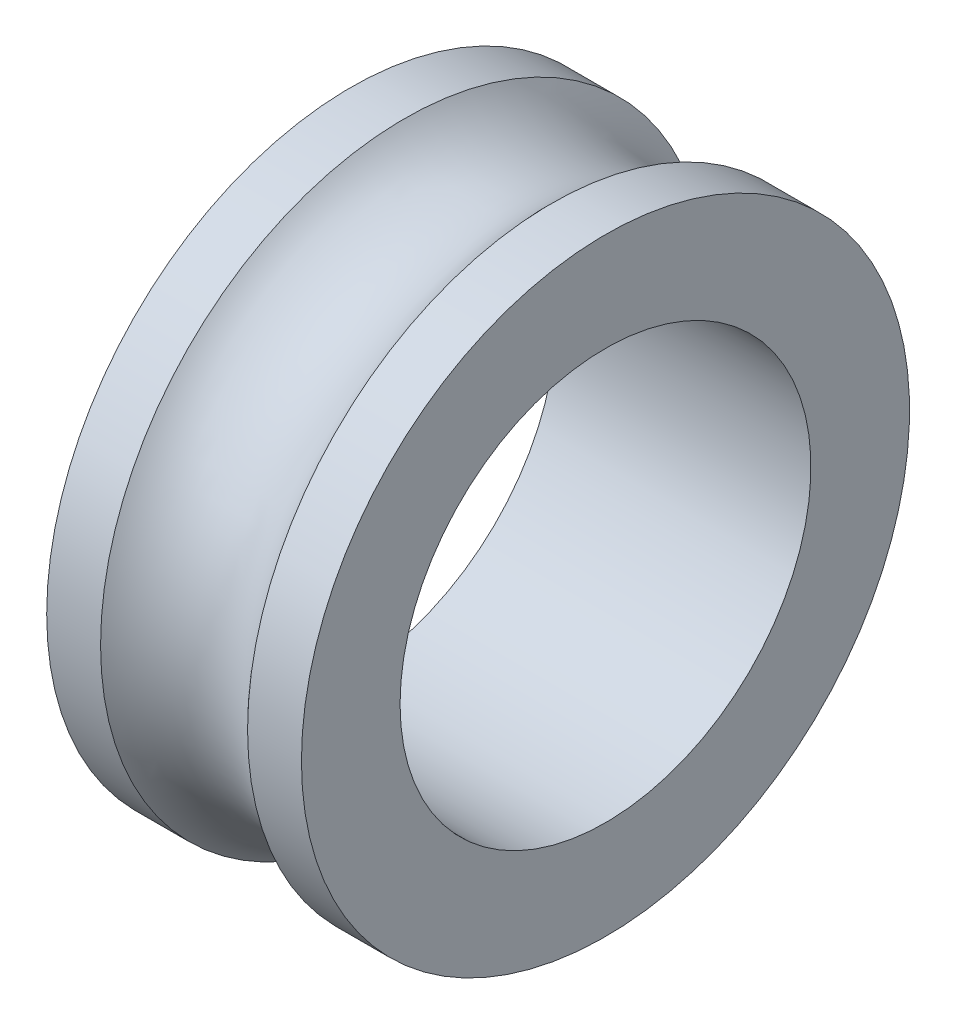
ISO-10303-21;
HEADER;
FILE_DESCRIPTION(('STEP AP214'),'2;1');
FILE_NAME('part.step','',(''),(''),'','','');
FILE_SCHEMA(('AUTOMOTIVE_DESIGN { 1 0 10303 214 1 1 1 1 }'));
ENDSEC;
DATA;
#1=APPLICATION_CONTEXT('core data for automotive mechanical design processes');
#2=APPLICATION_PROTOCOL_DEFINITION('international standard','automotive_design',2000,#1);
#3=PRODUCT_CONTEXT('',#1,'mechanical');
#4=PRODUCT('Part','Part','',(#3));
#5=PRODUCT_RELATED_PRODUCT_CATEGORY('part','',(#4));
#6=PRODUCT_DEFINITION_FORMATION('','',#4);
#7=PRODUCT_DEFINITION_CONTEXT('part definition',#1,'design');
#8=PRODUCT_DEFINITION('design','',#6,#7);
#9=PRODUCT_DEFINITION_SHAPE('','',#8);
#10=(LENGTH_UNIT() NAMED_UNIT(*) SI_UNIT(.MILLI.,.METRE.));
#11=(NAMED_UNIT(*) PLANE_ANGLE_UNIT() SI_UNIT($,.RADIAN.));
#12=(NAMED_UNIT(*) SI_UNIT($,.STERADIAN.) SOLID_ANGLE_UNIT());
#13=UNCERTAINTY_MEASURE_WITH_UNIT(LENGTH_MEASURE(1.E-05),#10,'distance_accuracy_value','');
#14=(GEOMETRIC_REPRESENTATION_CONTEXT(3) GLOBAL_UNCERTAINTY_ASSIGNED_CONTEXT((#13)) GLOBAL_UNIT_ASSIGNED_CONTEXT((#10,
#11,#12)) REPRESENTATION_CONTEXT('',''));
#15=CARTESIAN_POINT('',(0.,0.,0.));
#16=DIRECTION('',(0.,0.,1.));
#17=DIRECTION('',(1.,0.,0.));
#18=AXIS2_PLACEMENT_3D('',#15,#16,#17);
#19=CARTESIAN_POINT('',(-15.5,37.,0.));
#20=DIRECTION('',(1.,0.,0.));
#21=DIRECTION('',(0.,0.,-1.));
#22=AXIS2_PLACEMENT_3D('',#19,#20,#21);
#23=PLANE('',#22);
#24=CARTESIAN_POINT('',(-15.5,0.,0.));
#25=DIRECTION('',(-1.,0.,0.));
#26=DIRECTION('',(0.,0.,1.));
#27=AXIS2_PLACEMENT_3D('',#24,#25,#26);
#28=CIRCLE('',#27,25.);
#29=CARTESIAN_POINT('',(-15.5,0.,25.));
#30=VERTEX_POINT('',#29);
#31=EDGE_CURVE('E10',#30,#30,#28,.T.);
#32=ORIENTED_EDGE('',*,*,#31,.F.);
#33=EDGE_LOOP('',(#32));
#34=FACE_BOUND('',#33,.T.);
#35=CARTESIAN_POINT('',(-15.5,0.,0.));
#36=DIRECTION('',(-1.,0.,0.));
#37=DIRECTION('',(0.,0.,1.));
#38=AXIS2_PLACEMENT_3D('',#35,#36,#37);
#39=CIRCLE('',#38,37.);
#40=CARTESIAN_POINT('',(-15.5,0.,37.));
#41=VERTEX_POINT('',#40);
#42=EDGE_CURVE('E64',#41,#41,#39,.T.);
#43=ORIENTED_EDGE('',*,*,#42,.T.);
#44=EDGE_LOOP('',(#43));
#45=FACE_BOUND('',#44,.T.);
#46=ADVANCED_FACE('F37',(#34,#45),#23,.F.);
#47=CARTESIAN_POINT('',(0.,0.,0.));
#48=DIRECTION('',(-1.,0.,0.));
#49=DIRECTION('',(0.,0.,1.));
#50=AXIS2_PLACEMENT_3D('',#47,#48,#49);
#51=CYLINDRICAL_SURFACE('',#50,25.);
#52=CARTESIAN_POINT('',(15.5,0.,0.));
#53=DIRECTION('',(-1.,0.,0.));
#54=DIRECTION('',(0.,0.,1.));
#55=AXIS2_PLACEMENT_3D('',#52,#53,#54);
#56=CIRCLE('',#55,25.);
#57=CARTESIAN_POINT('',(15.5,0.,25.));
#58=VERTEX_POINT('',#57);
#59=EDGE_CURVE('E44',#58,#58,#56,.T.);
#60=ORIENTED_EDGE('',*,*,#59,.F.);
#61=EDGE_LOOP('',(#60));
#62=FACE_BOUND('',#61,.T.);
#63=ORIENTED_EDGE('',*,*,#31,.T.);
#64=EDGE_LOOP('',(#63));
#65=FACE_BOUND('',#64,.T.);
#66=ADVANCED_FACE('F90',(#62,#65),#51,.F.);
#67=CARTESIAN_POINT('',(15.5,37.,0.));
#68=DIRECTION('',(-1.,0.,0.));
#69=DIRECTION('',(0.,0.,1.));
#70=AXIS2_PLACEMENT_3D('',#67,#68,#69);
#71=PLANE('',#70);
#72=CARTESIAN_POINT('',(15.5,0.,0.));
#73=DIRECTION('',(-1.,0.,0.));
#74=DIRECTION('',(0.,0.,1.));
#75=AXIS2_PLACEMENT_3D('',#72,#73,#74);
#76=CIRCLE('',#75,37.);
#77=CARTESIAN_POINT('',(15.5,0.,37.));
#78=VERTEX_POINT('',#77);
#79=EDGE_CURVE('E49',#78,#78,#76,.T.);
#80=ORIENTED_EDGE('',*,*,#79,.F.);
#81=EDGE_LOOP('',(#80));
#82=FACE_BOUND('',#81,.T.);
#83=ORIENTED_EDGE('',*,*,#59,.T.);
#84=EDGE_LOOP('',(#83));
#85=FACE_BOUND('',#84,.T.);
#86=ADVANCED_FACE('F85',(#82,#85),#71,.F.);
#87=CARTESIAN_POINT('',(0.,0.,0.));
#88=DIRECTION('',(-1.,0.,0.));
#89=DIRECTION('',(0.,0.,1.));
#90=AXIS2_PLACEMENT_3D('',#87,#88,#89);
#91=CYLINDRICAL_SURFACE('',#90,37.);
#92=CARTESIAN_POINT('',(8.94427190999915,0.,0.));
#93=DIRECTION('',(-1.,0.,0.));
#94=DIRECTION('',(0.,0.,1.));
#95=AXIS2_PLACEMENT_3D('',#92,#93,#94);
#96=CIRCLE('',#95,37.);
#97=CARTESIAN_POINT('',(8.94427190999915,0.,37.));
#98=VERTEX_POINT('',#97);
#99=EDGE_CURVE('E54',#98,#98,#96,.T.);
#100=ORIENTED_EDGE('',*,*,#99,.F.);
#101=EDGE_LOOP('',(#100));
#102=FACE_BOUND('',#101,.T.);
#103=ORIENTED_EDGE('',*,*,#79,.T.);
#104=EDGE_LOOP('',(#103));
#105=FACE_BOUND('',#104,.T.);
#106=ADVANCED_FACE('F79',(#102,#105),#91,.T.);
#107=CARTESIAN_POINT('',(0.,0.,0.));
#108=DIRECTION('',(-1.,0.,0.));
#109=DIRECTION('',(0.,0.,1.));
#110=AXIS2_PLACEMENT_3D('',#107,#108,#109);
#111=TOROIDAL_SURFACE('',#110,45.,12.);
#112=CARTESIAN_POINT('',(-8.94427190999916,0.,0.));
#113=DIRECTION('',(-1.,0.,0.));
#114=DIRECTION('',(0.,0.,1.));
#115=AXIS2_PLACEMENT_3D('',#112,#113,#114);
#116=CIRCLE('',#115,37.);
#117=CARTESIAN_POINT('',(-8.94427190999916,0.,37.));
#118=VERTEX_POINT('',#117);
#119=EDGE_CURVE('E60',#118,#118,#116,.T.);
#120=ORIENTED_EDGE('',*,*,#119,.F.);
#121=EDGE_LOOP('',(#120));
#122=FACE_BOUND('',#121,.T.);
#123=ORIENTED_EDGE('',*,*,#99,.T.);
#124=EDGE_LOOP('',(#123));
#125=FACE_BOUND('',#124,.T.);
#126=ADVANCED_FACE('F73',(#122,#125),#111,.F.);
#127=CARTESIAN_POINT('',(0.,0.,0.));
#128=DIRECTION('',(-1.,0.,0.));
#129=DIRECTION('',(0.,0.,1.));
#130=AXIS2_PLACEMENT_3D('',#127,#128,#129);
#131=CYLINDRICAL_SURFACE('',#130,37.);
#132=ORIENTED_EDGE('',*,*,#42,.F.);
#133=EDGE_LOOP('',(#132));
#134=FACE_BOUND('',#133,.T.);
#135=ORIENTED_EDGE('',*,*,#119,.T.);
#136=EDGE_LOOP('',(#135));
#137=FACE_BOUND('',#136,.T.);
#138=ADVANCED_FACE('F70',(#134,#137),#131,.T.);
#139=CLOSED_SHELL('',(#46,#66,#86,#106,#126,#138));
#140=MANIFOLD_SOLID_BREP('B2',#139);
#141=ADVANCED_BREP_SHAPE_REPRESENTATION('',(#18,#140),#14);
#142=SHAPE_DEFINITION_REPRESENTATION(#9,#141);
ENDSEC;
END-ISO-10303-21;
